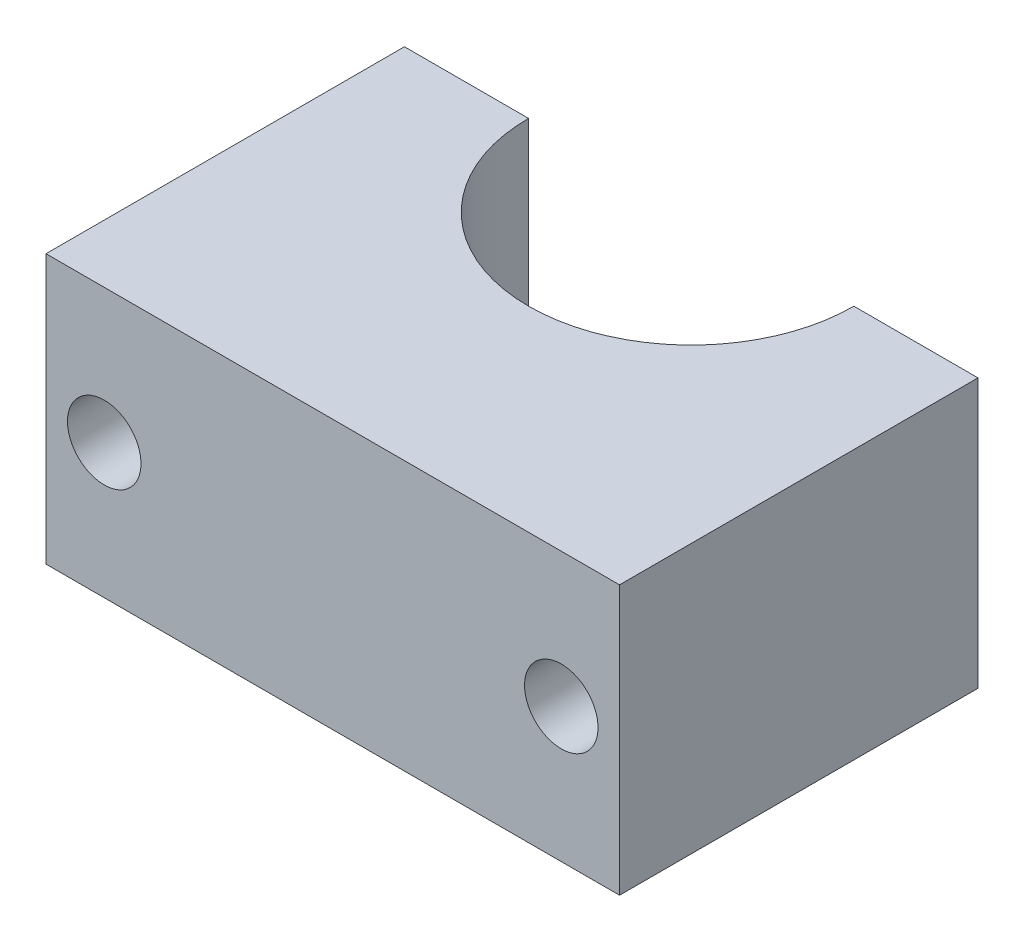
ISO-10303-21;
HEADER;
FILE_DESCRIPTION(('STEP AP214'),'2;1');
FILE_NAME('part.step','',(''),(''),'','','');
FILE_SCHEMA(('AUTOMOTIVE_DESIGN { 1 0 10303 214 1 1 1 1 }'));
ENDSEC;
DATA;
#1=APPLICATION_CONTEXT('core data for automotive mechanical design processes');
#2=APPLICATION_PROTOCOL_DEFINITION('international standard','automotive_design',2000,#1);
#3=PRODUCT_CONTEXT('',#1,'mechanical');
#4=PRODUCT('Part','Part','',(#3));
#5=PRODUCT_RELATED_PRODUCT_CATEGORY('part','',(#4));
#6=PRODUCT_DEFINITION_FORMATION('','',#4);
#7=PRODUCT_DEFINITION_CONTEXT('part definition',#1,'design');
#8=PRODUCT_DEFINITION('design','',#6,#7);
#9=PRODUCT_DEFINITION_SHAPE('','',#8);
#10=(LENGTH_UNIT() NAMED_UNIT(*) SI_UNIT(.MILLI.,.METRE.));
#11=(NAMED_UNIT(*) PLANE_ANGLE_UNIT() SI_UNIT($,.RADIAN.));
#12=(NAMED_UNIT(*) SI_UNIT($,.STERADIAN.) SOLID_ANGLE_UNIT());
#13=UNCERTAINTY_MEASURE_WITH_UNIT(LENGTH_MEASURE(1.E-05),#10,'distance_accuracy_value','');
#14=(GEOMETRIC_REPRESENTATION_CONTEXT(3) GLOBAL_UNCERTAINTY_ASSIGNED_CONTEXT((#13)) GLOBAL_UNIT_ASSIGNED_CONTEXT((#10,
#11,#12)) REPRESENTATION_CONTEXT('',''));
#15=CARTESIAN_POINT('',(0.,0.,0.));
#16=DIRECTION('',(0.,0.,1.));
#17=DIRECTION('',(1.,0.,0.));
#18=AXIS2_PLACEMENT_3D('',#15,#16,#17);
#19=CARTESIAN_POINT('',(-16.,15.,20.));
#20=DIRECTION('',(0.,0.,-1.));
#21=DIRECTION('',(1.,0.,0.));
#22=AXIS2_PLACEMENT_3D('',#19,#20,#21);
#23=PLANE('',#22);
#24=DIRECTION('',(-1.,0.,0.));
#25=VECTOR('',#24,1.);
#26=CARTESIAN_POINT('',(-16.,0.,20.));
#27=LINE('',#26,#25);
#28=CARTESIAN_POINT('',(16.,0.,20.));
#29=VERTEX_POINT('',#28);
#30=CARTESIAN_POINT('',(-16.,0.,20.));
#31=VERTEX_POINT('',#30);
#32=EDGE_CURVE('E162',#29,#31,#27,.T.);
#33=ORIENTED_EDGE('',*,*,#32,.F.);
#34=DIRECTION('',(0.,-1.,0.));
#35=VECTOR('',#34,1.);
#36=CARTESIAN_POINT('',(16.,15.,20.));
#37=LINE('',#36,#35);
#38=CARTESIAN_POINT('',(16.,15.,20.));
#39=VERTEX_POINT('',#38);
#40=EDGE_CURVE('E57',#39,#29,#37,.T.);
#41=ORIENTED_EDGE('',*,*,#40,.F.);
#42=DIRECTION('',(-1.,0.,0.));
#43=VECTOR('',#42,1.);
#44=CARTESIAN_POINT('',(-16.,15.,20.));
#45=LINE('',#44,#43);
#46=CARTESIAN_POINT('',(-16.,15.,20.));
#47=VERTEX_POINT('',#46);
#48=EDGE_CURVE('E147',#39,#47,#45,.T.);
#49=ORIENTED_EDGE('',*,*,#48,.T.);
#50=DIRECTION('',(0.,-1.,0.));
#51=VECTOR('',#50,1.);
#52=CARTESIAN_POINT('',(-16.,15.,20.));
#53=LINE('',#52,#51);
#54=EDGE_CURVE('E137',#47,#31,#53,.T.);
#55=ORIENTED_EDGE('',*,*,#54,.T.);
#56=EDGE_LOOP('',(#33,#41,#49,#55));
#57=FACE_BOUND('',#56,.T.);
#58=CARTESIAN_POINT('',(-14.8,7.5,20.));
#59=CARTESIAN_POINT('',(-14.8000026262811,7.53379238078154,20.));
#60=CARTESIAN_POINT('',(-14.7991942428179,7.56758643234124,20.));
#61=CARTESIAN_POINT('',(-14.795940558804,7.63486152308257,20.));
#62=CARTESIAN_POINT('',(-14.7935065964983,7.66834311264651,20.));
#63=CARTESIAN_POINT('',(-14.7870023729465,7.73499369051859,20.));
#64=CARTESIAN_POINT('',(-14.7829396115088,7.76816340802995,20.));
#65=CARTESIAN_POINT('',(-14.7731825877895,7.83418988229185,20.));
#66=CARTESIAN_POINT('',(-14.7674918203949,7.86704715530245,20.));
#67=CARTESIAN_POINT('',(-14.7544825667202,7.93244907028894,20.));
#68=CARTESIAN_POINT('',(-14.7471635470255,7.96499360615913,20.));
#69=CARTESIAN_POINT('',(-14.7309021282121,8.02977080317995,20.));
#70=CARTESIAN_POINT('',(-14.7219552596725,8.0620023417543,20.));
#71=CARTESIAN_POINT('',(-14.7024411762039,8.12615435267056,20.));
#72=CARTESIAN_POINT('',(-14.6918657567964,8.15807232720354,20.));
#73=CARTESIAN_POINT('',(-14.6691015062152,8.22159971705567,20.));
#74=CARTESIAN_POINT('',(-14.6569010682814,8.25320496793039,20.));
#75=CARTESIAN_POINT('',(-14.6310477444227,8.31569382551715,20.));
#76=CARTESIAN_POINT('',(-14.617399784548,8.34657946951019,20.));
#77=CARTESIAN_POINT('',(-14.5886987439907,8.4074420141325,20.));
#78=CARTESIAN_POINT('',(-14.5736555579828,8.43742357541499,20.));
#79=CARTESIAN_POINT('',(-14.542170984961,8.49648008477325,20.));
#80=CARTESIAN_POINT('',(-14.5257358095649,8.52555834336512,20.));
#81=CARTESIAN_POINT('',(-14.491470140949,8.58280939932996,20.));
#82=CARTESIAN_POINT('',(-14.4736422312409,8.6109837426031,20.));
#83=CARTESIAN_POINT('',(-14.4365949199421,8.66642885055445,20.));
#84=CARTESIAN_POINT('',(-14.4173746140664,8.69369901095303,20.));
#85=CARTESIAN_POINT('',(-14.3775461434011,8.74733815168312,20.));
#86=CARTESIAN_POINT('',(-14.3569338355963,8.77370405487961,20.));
#87=CARTESIAN_POINT('',(-14.3143237381426,8.8255364899181,20.));
#88=CARTESIAN_POINT('',(-14.2923188999089,8.85099722422196,20.));
#89=CARTESIAN_POINT('',(-14.246929665306,8.90102480318845,20.));
#90=CARTESIAN_POINT('',(-14.2235357481671,8.92558300266639,20.));
#91=CARTESIAN_POINT('',(-14.175708557466,8.97344821276768,20.));
#92=CARTESIAN_POINT('',(-14.1512803645065,8.99676029841686,20.));
#93=CARTESIAN_POINT('',(-14.101473180927,9.04200678177793,20.));
#94=CARTESIAN_POINT('',(-14.0761015509679,9.06394927464655,20.));
#95=CARTESIAN_POINT('',(-14.0244135766632,9.10646169520254,20.));
#96=CARTESIAN_POINT('',(-13.9981017038783,9.12703705816632,20.));
#97=CARTESIAN_POINT('',(-13.9445353328715,9.1668172522896,20.));
#98=CARTESIAN_POINT('',(-13.9172826300658,9.18602450053009,20.));
#99=CARTESIAN_POINT('',(-13.8618374488892,9.22307170433965,20.));
#100=CARTESIAN_POINT('',(-13.8336443664193,9.24091075572492,20.));
#101=CARTESIAN_POINT('',(-13.7763208549572,9.27522516249977,20.));
#102=CARTESIAN_POINT('',(-13.7471877759729,9.29169608967256,20.));
#103=CARTESIAN_POINT('',(-13.6879857780212,9.32327683132318,20.));
#104=CARTESIAN_POINT('',(-13.6579125657195,9.3383785923591,20.));
#105=CARTESIAN_POINT('',(-13.5968336753988,9.36722833218206,20.));
#106=CARTESIAN_POINT('',(-13.5658225097764,9.38096468057389,20.));
#107=CARTESIAN_POINT('',(-13.503318736159,9.40688369048613,20.));
#108=CARTESIAN_POINT('',(-13.4718288796688,9.41907298442377,20.));
#109=CARTESIAN_POINT('',(-13.4084979625986,9.44181490025927,20.));
#110=CARTESIAN_POINT('',(-13.3766606044999,9.45237781790876,20.));
#111=CARTESIAN_POINT('',(-13.3126383439554,9.47187404174329,20.));
#112=CARTESIAN_POINT('',(-13.280455492703,9.48081408066136,20.));
#113=CARTESIAN_POINT('',(-13.2157433976693,9.49706722508851,20.));
#114=CARTESIAN_POINT('',(-13.1832148876594,9.50438325076522,20.));
#115=CARTESIAN_POINT('',(-13.1178128684812,9.5173924518626,20.));
#116=CARTESIAN_POINT('',(-13.0849391472144,9.52308456074769,20.));
#117=CARTESIAN_POINT('',(-13.0188475732785,9.53285018071523,20.));
#118=CARTESIAN_POINT('',(-12.9856289669411,9.53691858655075,20.));
#119=CARTESIAN_POINT('',(-12.9188480261383,9.54343976360439,20.));
#120=CARTESIAN_POINT('',(-12.8852848070679,9.54588345142446,20.));
#121=CARTESIAN_POINT('',(-12.8178149529736,9.54916325617212,20.));
#122=CARTESIAN_POINT('',(-12.783907698825,9.5499865280008,20.));
#123=CARTESIAN_POINT('',(-12.7162429659983,9.55001341213798,20.));
#124=CARTESIAN_POINT('',(-12.6824854912632,9.54922420495638,20.));
#125=CARTESIAN_POINT('',(-12.6152723987964,9.54599930280762,20.));
#126=CARTESIAN_POINT('',(-12.5818162616979,9.54357453675292,20.));
#127=CARTESIAN_POINT('',(-12.5152065237006,9.53708644050198,20.));
#128=CARTESIAN_POINT('',(-12.482052241352,9.53303011549765,20.));
#129=CARTESIAN_POINT('',(-12.4160462521484,9.52328181632982,20.));
#130=CARTESIAN_POINT('',(-12.3831941057099,9.51759282085156,20.));
#131=CARTESIAN_POINT('',(-12.317792113078,9.50458348629703,20.));
#132=CARTESIAN_POINT('',(-12.2852424790765,9.49726208070377,20.));
#133=CARTESIAN_POINT('',(-12.2204446856773,9.48099218674987,20.));
#134=CARTESIAN_POINT('',(-12.1881977836743,9.47203869333971,20.));
#135=CARTESIAN_POINT('',(-12.1240046928868,9.45250751570445,20.));
#136=CARTESIAN_POINT('',(-12.0920611628998,9.44192110099016,20.));
#137=CARTESIAN_POINT('',(-12.0284720187022,9.4191316501212,20.));
#138=CARTESIAN_POINT('',(-11.9968307481015,9.40691650971376,20.));
#139=CARTESIAN_POINT('',(-11.9343063982561,9.38104717520967,20.));
#140=CARTESIAN_POINT('',(-11.9034205747921,9.36739961654805,20.));
#141=CARTESIAN_POINT('',(-11.8425578909684,9.33869885853335,20.));
#142=CARTESIAN_POINT('',(-11.8125763684626,9.32365555742574,20.));
#143=CARTESIAN_POINT('',(-11.7535198818038,9.29217089492878,20.));
#144=CARTESIAN_POINT('',(-11.7244416073022,9.27573574471328,20.));
#145=CARTESIAN_POINT('',(-11.667190537439,9.24147009213022,20.));
#146=CARTESIAN_POINT('',(-11.6390161960618,9.22364217348767,20.));
#147=CARTESIAN_POINT('',(-11.5835710904838,9.18659485653725,20.));
#148=CARTESIAN_POINT('',(-11.5563009304613,9.16737455409852,20.));
#149=CARTESIAN_POINT('',(-11.5026617942504,9.1275460900907,20.));
#150=CARTESIAN_POINT('',(-11.4762958950928,9.10693378564294,20.));
#151=CARTESIAN_POINT('',(-11.4244634704812,9.0643236980632,20.));
#152=CARTESIAN_POINT('',(-11.3990027424494,9.04231886648872,20.));
#153=CARTESIAN_POINT('',(-11.3489751789157,8.99692964731105,20.));
#154=CARTESIAN_POINT('',(-11.3244169884831,8.973535739064,20.));
#155=CARTESIAN_POINT('',(-11.2765517870985,8.92570855759071,20.));
#156=CARTESIAN_POINT('',(-11.2532397015473,8.90128036453979,20.));
#157=CARTESIAN_POINT('',(-11.2079932182574,8.85147318089373,20.));
#158=CARTESIAN_POINT('',(-11.1860507253628,8.82610155095892,20.));
#159=CARTESIAN_POINT('',(-11.1435383047878,8.77441357667183,20.));
#160=CARTESIAN_POINT('',(-11.1229629418309,8.74810170388043,20.));
#161=CARTESIAN_POINT('',(-11.0831827477127,8.69453533286895,20.));
#162=CARTESIAN_POINT('',(-11.0639754994704,8.66728263006495,20.));
#163=CARTESIAN_POINT('',(-11.0269282956594,8.61183744888957,20.));
#164=CARTESIAN_POINT('',(-11.0090892442747,8.58364436641919,20.));
#165=CARTESIAN_POINT('',(-10.9747748375002,8.52632085495677,20.));
#166=CARTESIAN_POINT('',(-10.9583039103273,8.49718777597262,20.));
#167=CARTESIAN_POINT('',(-10.9267231686766,8.43798577802109,20.));
#168=CARTESIAN_POINT('',(-10.9116214076408,8.4079125657194,20.));
#169=CARTESIAN_POINT('',(-10.8827716678179,8.34683367539867,20.));
#170=CARTESIAN_POINT('',(-10.8690353194261,8.31582250977641,20.));
#171=CARTESIAN_POINT('',(-10.8431163095138,8.25331873615883,20.));
#172=CARTESIAN_POINT('',(-10.8309270155761,8.2218288796685,20.));
#173=CARTESIAN_POINT('',(-10.8081850997405,8.15849796259797,20.));
#174=CARTESIAN_POINT('',(-10.797622182091,8.12666060449913,20.));
#175=CARTESIAN_POINT('',(-10.7781259582564,8.06263834395449,20.));
#176=CARTESIAN_POINT('',(-10.7691859193383,8.03045549270196,20.));
#177=CARTESIAN_POINT('',(-10.7529327749112,7.9657433976682,20.));
#178=CARTESIAN_POINT('',(-10.7456167492345,7.9332148876583,20.));
#179=CARTESIAN_POINT('',(-10.7326075481371,7.86781286848009,20.));
#180=CARTESIAN_POINT('',(-10.726915439252,7.83493914721325,20.));
#181=CARTESIAN_POINT('',(-10.7171498192845,7.76884757327745,20.));
#182=CARTESIAN_POINT('',(-10.713081413449,7.73562896694021,20.));
#183=CARTESIAN_POINT('',(-10.7065602363954,7.66884802613756,20.));
#184=CARTESIAN_POINT('',(-10.7041165485754,7.63528480706724,20.));
#185=CARTESIAN_POINT('',(-10.7008367438278,7.56781495297324,20.));
#186=CARTESIAN_POINT('',(-10.7000134719992,7.53390769882483,20.));
#187=CARTESIAN_POINT('',(-10.6999865878621,7.46624296599818,20.));
#188=CARTESIAN_POINT('',(-10.7007757950437,7.43248549126289,20.));
#189=CARTESIAN_POINT('',(-10.7040006971926,7.36527239879578,20.));
#190=CARTESIAN_POINT('',(-10.7064254632473,7.33181626169714,20.));
#191=CARTESIAN_POINT('',(-10.7129135594983,7.2652065236997,20.));
#192=CARTESIAN_POINT('',(-10.7169698845026,7.23205224135098,20.));
#193=CARTESIAN_POINT('',(-10.7267181836705,7.16604625214726,20.));
#194=CARTESIAN_POINT('',(-10.7324071791488,7.13319410570879,20.));
#195=CARTESIAN_POINT('',(-10.7454165137033,7.06779211307687,20.));
#196=CARTESIAN_POINT('',(-10.7527379192966,7.03524247907541,20.));
#197=CARTESIAN_POINT('',(-10.7690078132504,6.97044468567631,20.));
#198=CARTESIAN_POINT('',(-10.7779613066606,6.93819778367339,20.));
#199=CARTESIAN_POINT('',(-10.7974924842958,6.87400469288602,20.));
#200=CARTESIAN_POINT('',(-10.80807889901,6.84206116289914,20.));
#201=CARTESIAN_POINT('',(-10.8308683498789,6.77847201870184,20.));
#202=CARTESIAN_POINT('',(-10.8430834902863,6.74683074810129,20.));
#203=CARTESIAN_POINT('',(-10.8689528247903,6.68430639825613,20.));
#204=CARTESIAN_POINT('',(-10.882600383452,6.65342057479216,20.));
#205=CARTESIAN_POINT('',(-10.9113011414667,6.59255789096857,20.));
#206=CARTESIAN_POINT('',(-10.9263444425743,6.56257636846283,20.));
#207=CARTESIAN_POINT('',(-10.9578291050712,6.50351988180403,20.));
#208=CARTESIAN_POINT('',(-10.9742642552867,6.47444160730245,20.));
#209=CARTESIAN_POINT('',(-11.0085299078698,6.41719053743931,20.));
#210=CARTESIAN_POINT('',(-11.0263578265123,6.3890161960621,20.));
#211=CARTESIAN_POINT('',(-11.0634051434628,6.33357109048412,20.));
#212=CARTESIAN_POINT('',(-11.0826254459015,6.30630093046159,20.));
#213=CARTESIAN_POINT('',(-11.1224539099093,6.25266179425068,20.));
#214=CARTESIAN_POINT('',(-11.1430662143571,6.22629589509309,20.));
#215=CARTESIAN_POINT('',(-11.1856763019368,6.17446347048144,20.));
#216=CARTESIAN_POINT('',(-11.2076811335113,6.14900274244961,20.));
#217=CARTESIAN_POINT('',(-11.253070352689,6.09897517891584,20.));
#218=CARTESIAN_POINT('',(-11.276464260936,6.07441698848316,20.));
#219=CARTESIAN_POINT('',(-11.3242914424093,6.02655178709845,20.));
#220=CARTESIAN_POINT('',(-11.3487196354601,6.0032397015473,20.));
#221=CARTESIAN_POINT('',(-11.3985268191061,5.95799321825739,20.));
#222=CARTESIAN_POINT('',(-11.4238984490409,5.93605072536272,20.));
#223=CARTESIAN_POINT('',(-11.475586423328,5.89353830478773,20.));
#224=CARTESIAN_POINT('',(-11.5018982961194,5.87296294183085,20.));
#225=CARTESIAN_POINT('',(-11.5554646671308,5.8331827477126,20.));
#226=CARTESIAN_POINT('',(-11.5827173699348,5.81397549947025,20.));
#227=CARTESIAN_POINT('',(-11.6381625511102,5.77692829565933,20.));
#228=CARTESIAN_POINT('',(-11.6663556335806,5.75908924427457,20.));
#229=CARTESIAN_POINT('',(-11.723679145043,5.72477483750011,20.));
#230=CARTESIAN_POINT('',(-11.7528122240272,5.70830391032721,20.));
#231=CARTESIAN_POINT('',(-11.8120142219788,5.67672316867655,20.));
#232=CARTESIAN_POINT('',(-11.8420874342805,5.6616214076407,20.));
#233=CARTESIAN_POINT('',(-11.9031663246013,5.63277166781786,20.));
#234=CARTESIAN_POINT('',(-11.9341774902236,5.61903531942607,20.));
#235=CARTESIAN_POINT('',(-11.9966812638411,5.59311630951387,20.));
#236=CARTESIAN_POINT('',(-12.0281711203314,5.58092701557624,20.));
#237=CARTESIAN_POINT('',(-12.0915020374019,5.55818509974074,20.));
#238=CARTESIAN_POINT('',(-12.1233393955007,5.54762218209125,20.));
#239=CARTESIAN_POINT('',(-12.1873616560452,5.52812595825671,20.));
#240=CARTESIAN_POINT('',(-12.2195445072977,5.51918591933864,20.));
#241=CARTESIAN_POINT('',(-12.2842566023315,5.50293277491149,20.));
#242=CARTESIAN_POINT('',(-12.3167851123414,5.49561674923478,20.));
#243=CARTESIAN_POINT('',(-12.3821871315196,5.4826075481374,20.));
#244=CARTESIAN_POINT('',(-12.4150608527864,5.47691543925232,20.));
#245=CARTESIAN_POINT('',(-12.4811524267223,5.46714981928477,20.));
#246=CARTESIAN_POINT('',(-12.5143710330595,5.46308141344925,20.));
#247=CARTESIAN_POINT('',(-12.5811519738622,5.45656023639561,20.));
#248=CARTESIAN_POINT('',(-12.6147151929326,5.45411654857554,20.));
#249=CARTESIAN_POINT('',(-12.6821850470267,5.45083674382788,20.));
#250=CARTESIAN_POINT('',(-12.7160923011751,5.45001347199921,20.));
#251=CARTESIAN_POINT('',(-12.7837570340019,5.44998658786202,20.));
#252=CARTESIAN_POINT('',(-12.8175145087372,5.45077579504362,20.));
#253=CARTESIAN_POINT('',(-12.8847276012044,5.45400069719238,20.));
#254=CARTESIAN_POINT('',(-12.9181837383031,5.45642546324707,20.));
#255=CARTESIAN_POINT('',(-12.9847934763006,5.46291355949801,20.));
#256=CARTESIAN_POINT('',(-13.0179477586493,5.46696988450234,20.));
#257=CARTESIAN_POINT('',(-13.0839537478531,5.47671818367017,20.));
#258=CARTESIAN_POINT('',(-13.1168058942915,5.48240717914844,20.));
#259=CARTESIAN_POINT('',(-13.1822078869235,5.49541651370297,20.));
#260=CARTESIAN_POINT('',(-13.2147575209249,5.50273791929622,20.));
#261=CARTESIAN_POINT('',(-13.279555314324,5.51900781325013,20.));
#262=CARTESIAN_POINT('',(-13.3118022163269,5.52796130666028,20.));
#263=CARTESIAN_POINT('',(-13.3759953071142,5.54749248429554,20.));
#264=CARTESIAN_POINT('',(-13.4079388371011,5.55807889900982,20.));
#265=CARTESIAN_POINT('',(-13.4715279812983,5.5808683498788,20.));
#266=CARTESIAN_POINT('',(-13.5031692518988,5.59308349028624,20.));
#267=CARTESIAN_POINT('',(-13.5656936017441,5.61895282479048,20.));
#268=CARTESIAN_POINT('',(-13.5965794252082,5.63260038345227,20.));
#269=CARTESIAN_POINT('',(-13.6574421090322,5.66130114146723,20.));
#270=CARTESIAN_POINT('',(-13.6874236315381,5.67634444257495,20.));
#271=CARTESIAN_POINT('',(-13.7464801181971,5.70782910507207,20.));
#272=CARTESIAN_POINT('',(-13.7755583926988,5.72426425528763,20.));
#273=CARTESIAN_POINT('',(-13.832809462562,5.7585299078708,20.));
#274=CARTESIAN_POINT('',(-13.8609838039392,5.77635782651339,20.));
#275=CARTESIAN_POINT('',(-13.9164289095173,5.81340514346375,20.));
#276=CARTESIAN_POINT('',(-13.94369906954,5.83262544590237,20.));
#277=CARTESIAN_POINT('',(-13.9973382057502,5.87245390991034,20.));
#278=CARTESIAN_POINT('',(-14.023704104907,5.89306621435835,20.));
#279=CARTESIAN_POINT('',(-14.0755365295205,5.93567630193703,20.));
#280=CARTESIAN_POINT('',(-14.1009972575552,5.95768113351017,20.));
#281=CARTESIAN_POINT('',(-14.1510248210805,6.00307035269094,20.));
#282=CARTESIAN_POINT('',(-14.1755830115019,6.02646426094247,20.));
#283=CARTESIAN_POINT('',(-14.2234482129165,6.07429144240292,20.));
#284=CARTESIAN_POINT('',(-14.2467602985087,6.09871963543662,20.));
#285=CARTESIAN_POINT('',(-14.2920067816865,6.14852681912923,20.));
#286=CARTESIAN_POINT('',(-14.3139492744293,6.17389844912728,20.));
#287=CARTESIAN_POINT('',(-14.3564616954184,6.2255864232415,20.));
#288=CARTESIAN_POINT('',(-14.3770370589382,6.25189829579808,20.));
#289=CARTESIAN_POINT('',(-14.4168172515185,6.3054646674509,20.));
#290=CARTESIAN_POINT('',(-14.436024497665,6.33271737112906,20.));
#291=CARTESIAN_POINT('',(-14.473071707206,6.38816254991451,20.));
#292=CARTESIAN_POINT('',(-14.4909107664233,6.41635562911809,20.));
#293=CARTESIAN_POINT('',(-14.5252251517674,6.47367914951882,20.));
#294=CARTESIAN_POINT('',(-14.5416960495617,6.50281224075638,20.));
#295=CARTESIAN_POINT('',(-14.5732768716559,6.56201420515632,20.));
#296=CARTESIAN_POINT('',(-14.5883787432867,6.59208737133072,20.));
#297=CARTESIAN_POINT('',(-14.6172281800625,6.65316638804775,20.));
#298=CARTESIAN_POINT('',(-14.6309641106664,6.68417772792286,20.));
#299=CARTESIAN_POINT('',(-14.6568992055898,6.74671707183676,20.));
#300=CARTESIAN_POINT('',(-14.6691032809169,6.77824303852396,20.));
#301=CARTESIAN_POINT('',(-14.6918705260358,6.8416358689415,20.));
#302=CARTESIAN_POINT('',(-14.7024444972854,6.87349884771985,20.));
#303=CARTESIAN_POINT('',(-14.7219578983163,6.93756229191174,20.));
#304=CARTESIAN_POINT('',(-14.7309045906109,6.96976054403643,20.));
#305=CARTESIAN_POINT('',(-14.7471662671319,7.03449329432325,20.));
#306=CARTESIAN_POINT('',(-14.7544847095573,7.06702692328642,20.));
#307=CARTESIAN_POINT('',(-14.7674939391066,7.13242900013863,20.));
#308=CARTESIAN_POINT('',(-14.7731841929088,7.16529755409148,20.));
#309=CARTESIAN_POINT('',(-14.7829412419155,7.23136866722272,20.));
#310=CARTESIAN_POINT('',(-14.7870034464539,7.26457190395985,20.));
#311=CARTESIAN_POINT('',(-14.7935076741373,7.33131161252729,20.));
#312=CARTESIAN_POINT('',(-14.7959410991598,7.36484891885623,20.));
#313=CARTESIAN_POINT('',(-14.7991947601912,7.43225769630303,20.));
#314=CARTESIAN_POINT('',(-14.8000025855025,7.46612976890305,20.));
#315=CARTESIAN_POINT('',(-14.8,7.5,20.));
#316=B_SPLINE_CURVE_WITH_KNOTS('',3,(#58,#59,#60,#61,#62,#63,#64,#65,#66,#67,#68,#69,#70,#71,
#72,#73,#74,#75,#76,#77,#78,#79,#80,#81,#82,#83,#84,#85,#86,#87,#88,#89,#90,#91,#92,#93,#94,#95,
#96,#97,#98,#99,#100,#101,#102,#103,#104,#105,#106,#107,#108,#109,#110,#111,#112,#113,#114,#115,
#116,#117,#118,#119,#120,#121,#122,#123,#124,#125,#126,#127,#128,#129,#130,#131,#132,#133,#134,
#135,#136,#137,#138,#139,#140,#141,#142,#143,#144,#145,#146,#147,#148,#149,#150,#151,#152,#153,
#154,#155,#156,#157,#158,#159,#160,#161,#162,#163,#164,#165,#166,#167,#168,#169,#170,#171,#172,
#173,#174,#175,#176,#177,#178,#179,#180,#181,#182,#183,#184,#185,#186,#187,#188,#189,#190,#191,
#192,#193,#194,#195,#196,#197,#198,#199,#200,#201,#202,#203,#204,#205,#206,#207,#208,#209,#210,
#211,#212,#213,#214,#215,#216,#217,#218,#219,#220,#221,#222,#223,#224,#225,#226,#227,#228,#229,
#230,#231,#232,#233,#234,#235,#236,#237,#238,#239,#240,#241,#242,#243,#244,#245,#246,#247,#248,
#249,#250,#251,#252,#253,#254,#255,#256,#257,#258,#259,#260,#261,#262,#263,#264,#265,#266,#267,
#268,#269,#270,#271,#272,#273,#274,#275,#276,#277,#278,#279,#280,#281,#282,#283,#284,#285,#286,
#287,#288,#289,#290,#291,#292,#293,#294,#295,#296,#297,#298,#299,#300,#301,#302,#303,#304,#305,
#306,#307,#308,#309,#310,#311,#312,#313,#314,#315),.UNSPECIFIED.,.F.,.F.,(4,2,2,2,2,2,2,2,2,2,2,
2,2,2,2,2,2,2,2,2,2,2,2,2,2,2,2,2,2,2,2,2,2,2,2,2,2,2,2,2,2,2,2,2,2,2,2,2,2,2,2,2,2,2,2,2,2,2,2,
2,2,2,2,2,2,2,2,2,2,2,2,2,2,2,2,2,2,2,2,2,2,2,2,2,2,2,2,2,2,2,2,2,2,2,2,2,2,2,2,2,2,2,2,2,2,2,2,
2,2,2,2,2,2,2,2,2,2,2,2,2,2,2,2,2,2,2,2,2,4),(0.,0.10136980817498,0.202039855299107,
0.302251595174341,0.402249801518129,0.502280815595935,0.602590736965651,0.703423623045886,
0.805019762478675,0.906280627433045,1.00687148636581,1.10703499589193,1.20701692421191,
1.30706437770678,1.40742397874859,1.50834006122293,1.6100529487687,1.71131384927551,
1.81190473405127,1.9120682593176,2.01205019295003,2.11209764107978,2.21245722590833,
2.31337328123124,2.41508613067616,2.51634703118277,2.61693791595838,2.71710144122462,
2.81708337485703,2.9171308229868,3.01749040781545,3.11840646313851,3.22011931258365,
3.3213802130902,3.42197109786577,3.52213462313199,3.62211655676439,3.72216400489417,
3.82252358972284,3.92343964504594,4.02515249449112,4.1264133949979,4.22700427977362,
4.32716780503993,4.42714973867236,4.52719718680211,4.62755677163069,4.72847282695365,
4.83018567639864,4.93144657690559,5.03203746168145,5.13220098694785,5.23218292058031,
5.33223036871003,5.43258995353852,5.53350600886133,5.63521885830611,5.73647975881325,
5.83707064358923,5.9372341688557,6.03721610248818,6.13726355061788,6.2376231354463,
6.338539190769,6.44025204021363,6.54151294072069,6.64210382549662,6.74226735076306,
6.84224928439553,6.94229673252524,7.04265631735369,7.14357237267641,7.24528522212107,
7.34654612262771,7.44713700740334,7.5473005326696,7.64728246630201,7.74732991443178,
7.84768949926041,7.94860555458345,8.05031840402855,8.15157930453546,8.25217018931128,
8.35233371457765,8.4523156482101,8.55236309633984,8.65272268116835,8.75363873649122,
8.85535158593607,8.95661248644302,9.05720337121887,9.15736689648526,9.25734883011771,
9.35739627824744,9.45775586307593,9.55867191839874,9.66038476784352,9.76164566835073,
9.86223655312676,9.96240007839325,10.0623820120257,10.1624294601554,10.2627890449838,
10.3637051003065,10.4654179497511,10.5666788502585,10.6672697350346,10.7674332603012,
10.8674151939337,10.9674626420634,11.0678222268917,11.1687382822142,11.2704511316585,
11.3717120321651,11.4723029169407,11.572466442207,11.6724483758394,11.7724958239691,
11.8728554087978,11.9737714641208,12.0754843135659,12.1768622657421,12.2775365608504,
12.3777498909528,12.4777483043971,12.5777794354468,12.6780906760597,12.7789273565587,
12.8805310011848),.UNSPECIFIED.);
#317=CARTESIAN_POINT('',(-14.8,7.5,20.));
#318=VERTEX_POINT('',#317);
#319=EDGE_CURVE('E187',#318,#318,#316,.T.);
#320=ORIENTED_EDGE('',*,*,#319,.T.);
#321=EDGE_LOOP('',(#320));
#322=FACE_BOUND('',#321,.T.);
#323=CARTESIAN_POINT('',(10.7,7.5,20.));
#324=CARTESIAN_POINT('',(10.6999973737189,7.53379238078154,20.));
#325=CARTESIAN_POINT('',(10.7008057571821,7.56758643234124,20.));
#326=CARTESIAN_POINT('',(10.704059441196,7.63486152308257,20.));
#327=CARTESIAN_POINT('',(10.7064934035017,7.66834311264651,20.));
#328=CARTESIAN_POINT('',(10.7129976270535,7.73499369051859,20.));
#329=CARTESIAN_POINT('',(10.7170603884912,7.76816340802996,20.));
#330=CARTESIAN_POINT('',(10.7268174122105,7.83418988229185,20.));
#331=CARTESIAN_POINT('',(10.7325081796051,7.86704715530245,20.));
#332=CARTESIAN_POINT('',(10.7455174332798,7.93244907028894,20.));
#333=CARTESIAN_POINT('',(10.7528364529745,7.96499360615913,20.));
#334=CARTESIAN_POINT('',(10.7690978717879,8.02977080317995,20.));
#335=CARTESIAN_POINT('',(10.7780447403275,8.06200234175431,20.));
#336=CARTESIAN_POINT('',(10.7975588237961,8.12615435267056,20.));
#337=CARTESIAN_POINT('',(10.8081342432036,8.15807232720354,20.));
#338=CARTESIAN_POINT('',(10.8308984937848,8.22159971705568,20.));
#339=CARTESIAN_POINT('',(10.8430989317186,8.25320496793039,20.));
#340=CARTESIAN_POINT('',(10.8689522555772,8.31569382551706,20.));
#341=CARTESIAN_POINT('',(10.8826002154519,8.34657946951002,20.));
#342=CARTESIAN_POINT('',(10.9113012560092,8.40744201413218,20.));
#343=CARTESIAN_POINT('',(10.926344442017,8.43742357541461,20.));
#344=CARTESIAN_POINT('',(10.9578290150388,8.49648008477278,20.));
#345=CARTESIAN_POINT('',(10.9742641904348,8.52555834336461,20.));
#346=CARTESIAN_POINT('',(11.0085298590508,8.58280939932941,20.));
#347=CARTESIAN_POINT('',(11.0263577687589,8.61098374260253,20.));
#348=CARTESIAN_POINT('',(11.0634050800577,8.66642885055388,20.));
#349=CARTESIAN_POINT('',(11.0826253859334,8.69369901095248,20.));
#350=CARTESIAN_POINT('',(11.1224538565987,8.74733815168261,20.));
#351=CARTESIAN_POINT('',(11.1430661644035,8.77370405487914,20.));
#352=CARTESIAN_POINT('',(11.1856762618572,8.82553648991773,20.));
#353=CARTESIAN_POINT('',(11.207681100091,8.85099722422164,20.));
#354=CARTESIAN_POINT('',(11.2530703346939,8.90102480318828,20.));
#355=CARTESIAN_POINT('',(11.2764642518329,8.9255830026663,20.));
#356=CARTESIAN_POINT('',(11.324291442534,8.97344821276772,20.));
#357=CARTESIAN_POINT('',(11.3487196354934,8.99676029841694,20.));
#358=CARTESIAN_POINT('',(11.398526819073,9.04200678177806,20.));
#359=CARTESIAN_POINT('',(11.423898449032,9.06394927464671,20.));
#360=CARTESIAN_POINT('',(11.4755864233367,9.10646169520273,20.));
#361=CARTESIAN_POINT('',(11.5018982961216,9.12703705816653,20.));
#362=CARTESIAN_POINT('',(11.5554646671284,9.16681725228983,20.));
#363=CARTESIAN_POINT('',(11.5827173699341,9.18602450053033,20.));
#364=CARTESIAN_POINT('',(11.6381625511107,9.22307170433989,20.));
#365=CARTESIAN_POINT('',(11.6663556335806,9.24091075572515,20.));
#366=CARTESIAN_POINT('',(11.7236791450428,9.27522516249998,20.));
#367=CARTESIAN_POINT('',(11.7528122240271,9.29169608967276,20.));
#368=CARTESIAN_POINT('',(11.8120142219787,9.32327683132334,20.));
#369=CARTESIAN_POINT('',(11.8420874342804,9.33837859235924,20.));
#370=CARTESIAN_POINT('',(11.9031663246012,9.36722833218213,20.));
#371=CARTESIAN_POINT('',(11.9341774902235,9.38096468057392,20.));
#372=CARTESIAN_POINT('',(11.9966812638411,9.40688369048613,20.));
#373=CARTESIAN_POINT('',(12.0281711203314,9.41907298442376,20.));
#374=CARTESIAN_POINT('',(12.0915020374018,9.44181490025927,20.));
#375=CARTESIAN_POINT('',(12.1233393955006,9.45237781790875,20.));
#376=CARTESIAN_POINT('',(12.1873616560451,9.47187404174329,20.));
#377=CARTESIAN_POINT('',(12.2195445072976,9.48081408066136,20.));
#378=CARTESIAN_POINT('',(12.2842566023313,9.49706722508851,20.));
#379=CARTESIAN_POINT('',(12.3167851123412,9.50438325076522,20.));
#380=CARTESIAN_POINT('',(12.3821871315194,9.5173924518626,20.));
#381=CARTESIAN_POINT('',(12.4150608527863,9.52308456074768,20.));
#382=CARTESIAN_POINT('',(12.4811524267221,9.53285018071523,20.));
#383=CARTESIAN_POINT('',(12.5143710330594,9.53691858655075,20.));
#384=CARTESIAN_POINT('',(12.5811519738621,9.54343976360439,20.));
#385=CARTESIAN_POINT('',(12.6147151929325,9.54588345142446,20.));
#386=CARTESIAN_POINT('',(12.6821850470266,9.54916325617212,20.));
#387=CARTESIAN_POINT('',(12.7160923011751,9.54998652800079,20.));
#388=CARTESIAN_POINT('',(12.7837570340016,9.55001341213798,20.));
#389=CARTESIAN_POINT('',(12.8175145087368,9.54922420495638,20.));
#390=CARTESIAN_POINT('',(12.8847276012036,9.54599930280762,20.));
#391=CARTESIAN_POINT('',(12.9181837383021,9.54357453675292,20.));
#392=CARTESIAN_POINT('',(12.9847934762994,9.53708644050198,20.));
#393=CARTESIAN_POINT('',(13.017947758648,9.53303011549765,20.));
#394=CARTESIAN_POINT('',(13.0839537478516,9.52328181632982,20.));
#395=CARTESIAN_POINT('',(13.1168058942901,9.51759282085156,20.));
#396=CARTESIAN_POINT('',(13.182207886922,9.50458348629703,20.));
#397=CARTESIAN_POINT('',(13.2147575209235,9.49726208070377,20.));
#398=CARTESIAN_POINT('',(13.2795553143227,9.48099218674987,20.));
#399=CARTESIAN_POINT('',(13.3118022163257,9.47203869333971,20.));
#400=CARTESIAN_POINT('',(13.3759953071132,9.45250751570445,20.));
#401=CARTESIAN_POINT('',(13.4079388371002,9.44192110099017,20.));
#402=CARTESIAN_POINT('',(13.4715279812978,9.4191316501212,20.));
#403=CARTESIAN_POINT('',(13.5031692518985,9.40691650971376,20.));
#404=CARTESIAN_POINT('',(13.565693601744,9.38104717520964,20.));
#405=CARTESIAN_POINT('',(13.5965794252081,9.36739961654798,20.));
#406=CARTESIAN_POINT('',(13.6574421090319,9.33869885853322,20.));
#407=CARTESIAN_POINT('',(13.6874236315378,9.32365555742559,20.));
#408=CARTESIAN_POINT('',(13.7464801181967,9.29217089492859,20.));
#409=CARTESIAN_POINT('',(13.7755583926983,9.27573574471308,20.));
#410=CARTESIAN_POINT('',(13.8328094625616,9.24147009213,20.));
#411=CARTESIAN_POINT('',(13.8609838039388,9.22364217348744,20.));
#412=CARTESIAN_POINT('',(13.9164289095168,9.18659485653702,20.));
#413=CARTESIAN_POINT('',(13.9436990695393,9.16737455409829,20.));
#414=CARTESIAN_POINT('',(13.9973382057501,9.12754609009049,20.));
#415=CARTESIAN_POINT('',(14.0237041049077,9.10693378564275,20.));
#416=CARTESIAN_POINT('',(14.0755365295192,9.06432369806305,20.));
#417=CARTESIAN_POINT('',(14.1009972575509,9.0423188664886,20.));
#418=CARTESIAN_POINT('',(14.1510248210844,8.99692964731098,20.));
#419=CARTESIAN_POINT('',(14.175583011517,8.97353573906397,20.));
#420=CARTESIAN_POINT('',(14.2234482129016,8.92570855759054,20.));
#421=CARTESIAN_POINT('',(14.2467602984529,8.90128036453945,20.));
#422=CARTESIAN_POINT('',(14.292006781743,8.8514731808931,20.));
#423=CARTESIAN_POINT('',(14.3139492746377,8.82610155095817,20.));
#424=CARTESIAN_POINT('',(14.3564616952128,8.7744135766709,20.));
#425=CARTESIAN_POINT('',(14.3770370581698,8.74810170387943,20.));
#426=CARTESIAN_POINT('',(14.4168172522881,8.69453533286785,20.));
#427=CARTESIAN_POINT('',(14.4360245005304,8.66728263006383,20.));
#428=CARTESIAN_POINT('',(14.4730717043414,8.61183744888845,20.));
#429=CARTESIAN_POINT('',(14.4909107557261,8.58364436641809,20.));
#430=CARTESIAN_POINT('',(14.5252251625005,8.52632085495576,20.));
#431=CARTESIAN_POINT('',(14.5416960896734,8.49718777597168,20.));
#432=CARTESIAN_POINT('',(14.5732768313239,8.43798577802035,20.));
#433=CARTESIAN_POINT('',(14.5883785923597,8.40791256571878,20.));
#434=CARTESIAN_POINT('',(14.6172283321823,8.34683367539833,20.));
#435=CARTESIAN_POINT('',(14.630964680574,8.31582250977624,20.));
#436=CARTESIAN_POINT('',(14.6568836904861,8.25331873615883,20.));
#437=CARTESIAN_POINT('',(14.6690729844238,8.2218288796685,20.));
#438=CARTESIAN_POINT('',(14.6918149002593,8.15849796259796,20.));
#439=CARTESIAN_POINT('',(14.7023778179087,8.12666060449913,20.));
#440=CARTESIAN_POINT('',(14.7218740417433,8.06263834395449,20.));
#441=CARTESIAN_POINT('',(14.7308140806614,8.03045549270196,20.));
#442=CARTESIAN_POINT('',(14.7470672250885,7.9657433976682,20.));
#443=CARTESIAN_POINT('',(14.7543832507652,7.9332148876583,20.));
#444=CARTESIAN_POINT('',(14.7673924518626,7.86781286848009,20.));
#445=CARTESIAN_POINT('',(14.7730845607477,7.83493914721325,20.));
#446=CARTESIAN_POINT('',(14.7828501807152,7.76884757327745,20.));
#447=CARTESIAN_POINT('',(14.7869185865508,7.73562896694021,20.));
#448=CARTESIAN_POINT('',(14.7934397636044,7.66884802613756,20.));
#449=CARTESIAN_POINT('',(14.7958834514245,7.63528480706724,20.));
#450=CARTESIAN_POINT('',(14.7991632561721,7.56781495297324,20.));
#451=CARTESIAN_POINT('',(14.7999865280008,7.53390769882483,20.));
#452=CARTESIAN_POINT('',(14.800013412138,7.46624296599818,20.));
#453=CARTESIAN_POINT('',(14.7992242049564,7.43248549126289,20.));
#454=CARTESIAN_POINT('',(14.7959993028076,7.36527239879578,20.));
#455=CARTESIAN_POINT('',(14.7935745367529,7.33181626169714,20.));
#456=CARTESIAN_POINT('',(14.787086440502,7.2652065236997,20.));
#457=CARTESIAN_POINT('',(14.7830301154977,7.23205224135098,20.));
#458=CARTESIAN_POINT('',(14.7732818163298,7.16604625214726,20.));
#459=CARTESIAN_POINT('',(14.7675928208516,7.13319410570879,20.));
#460=CARTESIAN_POINT('',(14.754583486297,7.06779211307686,20.));
#461=CARTESIAN_POINT('',(14.7472620807038,7.03524247907541,20.));
#462=CARTESIAN_POINT('',(14.7309921867499,6.9704446856763,20.));
#463=CARTESIAN_POINT('',(14.7220386933397,6.93819778367338,20.));
#464=CARTESIAN_POINT('',(14.7025075157045,6.87400469288601,20.));
#465=CARTESIAN_POINT('',(14.6919211009902,6.84206116289914,20.));
#466=CARTESIAN_POINT('',(14.6691316501212,6.77847201870184,20.));
#467=CARTESIAN_POINT('',(14.6569165097138,6.74683074810129,20.));
#468=CARTESIAN_POINT('',(14.6310471752096,6.68430639825613,20.));
#469=CARTESIAN_POINT('',(14.6173996165479,6.65342057479216,20.));
#470=CARTESIAN_POINT('',(14.5886988585332,6.59255789096857,20.));
#471=CARTESIAN_POINT('',(14.5736555574255,6.56257636846283,20.));
#472=CARTESIAN_POINT('',(14.5421708949285,6.50351988180403,20.));
#473=CARTESIAN_POINT('',(14.525735744713,6.47444160730245,20.));
#474=CARTESIAN_POINT('',(14.4914700921299,6.41719053743932,20.));
#475=CARTESIAN_POINT('',(14.4736421734873,6.3890161960621,20.));
#476=CARTESIAN_POINT('',(14.4365948565369,6.33357109048412,20.));
#477=CARTESIAN_POINT('',(14.4173745540982,6.3063009304616,20.));
#478=CARTESIAN_POINT('',(14.3775460900904,6.25266179425069,20.));
#479=CARTESIAN_POINT('',(14.3569337856427,6.22629589509309,20.));
#480=CARTESIAN_POINT('',(14.314323698063,6.17446347048144,20.));
#481=CARTESIAN_POINT('',(14.2923188664885,6.14900274244962,20.));
#482=CARTESIAN_POINT('',(14.2469296473109,6.09897517891585,20.));
#483=CARTESIAN_POINT('',(14.223535739064,6.07441698848316,20.));
#484=CARTESIAN_POINT('',(14.1757085575909,6.02655178709856,20.));
#485=CARTESIAN_POINT('',(14.1512803645402,6.0032397015475,20.));
#486=CARTESIAN_POINT('',(14.1014731808944,5.95799321825777,20.));
#487=CARTESIAN_POINT('',(14.0761015509598,5.93605072536318,20.));
#488=CARTESIAN_POINT('',(14.0244135766729,5.89353830478831,20.));
#489=CARTESIAN_POINT('',(13.9981017038816,5.87296294183148,20.));
#490=CARTESIAN_POINT('',(13.9445353328702,5.83318274771329,20.));
#491=CARTESIAN_POINT('',(13.9172826300662,5.81397549947095,20.));
#492=CARTESIAN_POINT('',(13.8618374488908,5.77692829566003,20.));
#493=CARTESIAN_POINT('',(13.8336443664204,5.75908924427526,20.));
#494=CARTESIAN_POINT('',(13.7763208549579,5.72477483750074,20.));
#495=CARTESIAN_POINT('',(13.7471877759737,5.70830391032779,20.));
#496=CARTESIAN_POINT('',(13.6879857780219,5.67672316867701,20.));
#497=CARTESIAN_POINT('',(13.6579125657201,5.66162140764109,20.));
#498=CARTESIAN_POINT('',(13.596833675399,5.63277166781807,20.));
#499=CARTESIAN_POINT('',(13.5658225097766,5.61903531942617,20.));
#500=CARTESIAN_POINT('',(13.503318736159,5.59311630951387,20.));
#501=CARTESIAN_POINT('',(13.4718288796688,5.58092701557623,20.));
#502=CARTESIAN_POINT('',(13.4084979625985,5.55818509974073,20.));
#503=CARTESIAN_POINT('',(13.3766606044998,5.54762218209124,20.));
#504=CARTESIAN_POINT('',(13.3126383439553,5.52812595825671,20.));
#505=CARTESIAN_POINT('',(13.2804554927028,5.51918591933864,20.));
#506=CARTESIAN_POINT('',(13.2157433976692,5.50293277491149,20.));
#507=CARTESIAN_POINT('',(13.1832148876593,5.49561674923478,20.));
#508=CARTESIAN_POINT('',(13.1178128684811,5.4826075481374,20.));
#509=CARTESIAN_POINT('',(13.0849391472142,5.47691543925231,20.));
#510=CARTESIAN_POINT('',(13.0188475732783,5.46714981928477,20.));
#511=CARTESIAN_POINT('',(12.985628966941,5.46308141344925,20.));
#512=CARTESIAN_POINT('',(12.9188480261382,5.45656023639561,20.));
#513=CARTESIAN_POINT('',(12.8852848070678,5.45411654857554,20.));
#514=CARTESIAN_POINT('',(12.8178149529735,5.45083674382788,20.));
#515=CARTESIAN_POINT('',(12.783907698825,5.45001347199921,20.));
#516=CARTESIAN_POINT('',(12.716242965998,5.44998658786202,20.));
#517=CARTESIAN_POINT('',(12.6824854912626,5.45077579504362,20.));
#518=CARTESIAN_POINT('',(12.6152723987952,5.45400069719238,20.));
#519=CARTESIAN_POINT('',(12.5818162616965,5.45642546324707,20.));
#520=CARTESIAN_POINT('',(12.5152065236989,5.46291355949801,20.));
#521=CARTESIAN_POINT('',(12.4820522413501,5.46696988450234,20.));
#522=CARTESIAN_POINT('',(12.4160462521463,5.47671818367017,20.));
#523=CARTESIAN_POINT('',(12.3831941057078,5.48240717914843,20.));
#524=CARTESIAN_POINT('',(12.3177921130759,5.49541651370296,20.));
#525=CARTESIAN_POINT('',(12.2852424790744,5.50273791929622,20.));
#526=CARTESIAN_POINT('',(12.2204446856754,5.51900781325012,20.));
#527=CARTESIAN_POINT('',(12.1881977836726,5.52796130666028,20.));
#528=CARTESIAN_POINT('',(12.1240046928854,5.54749248429553,20.));
#529=CARTESIAN_POINT('',(12.0920611628986,5.55807889900982,20.));
#530=CARTESIAN_POINT('',(12.0284720187015,5.58086834987879,20.));
#531=CARTESIAN_POINT('',(11.9968307481011,5.59308349028625,20.));
#532=CARTESIAN_POINT('',(11.9343063982558,5.61895282479059,20.));
#533=CARTESIAN_POINT('',(11.9034205747914,5.63260038345248,20.));
#534=CARTESIAN_POINT('',(11.8425578909672,5.66130114146763,20.));
#535=CARTESIAN_POINT('',(11.8125763684613,5.67634444257541,20.));
#536=CARTESIAN_POINT('',(11.753519881802,5.70782910507265,20.));
#537=CARTESIAN_POINT('',(11.7244416073003,5.72426425528826,20.));
#538=CARTESIAN_POINT('',(11.667190537437,5.75852990787148,20.));
#539=CARTESIAN_POINT('',(11.6390161960598,5.77635782651409,20.));
#540=CARTESIAN_POINT('',(11.5835710904817,5.81340514346445,20.));
#541=CARTESIAN_POINT('',(11.556300930459,5.83262544590306,20.));
#542=CARTESIAN_POINT('',(11.5026617942488,5.87245390991097,20.));
#543=CARTESIAN_POINT('',(11.4762958950922,5.89306621435893,20.));
#544=CARTESIAN_POINT('',(11.4244634704788,5.93567630193749,20.));
#545=CARTESIAN_POINT('',(11.3990027424443,5.95768113351055,20.));
#546=CARTESIAN_POINT('',(11.3489751789192,6.00307035269115,20.));
#547=CARTESIAN_POINT('',(11.3244169884979,6.02646426094257,20.));
#548=CARTESIAN_POINT('',(11.2765517870834,6.074291442403,20.));
#549=CARTESIAN_POINT('',(11.2532397014913,6.09871963543679,20.));
#550=CARTESIAN_POINT('',(11.2079932183134,6.14852681912955,20.));
#551=CARTESIAN_POINT('',(11.1860507255706,6.17389844912765,20.));
#552=CARTESIAN_POINT('',(11.1435383045814,6.22558642324196,20.));
#553=CARTESIAN_POINT('',(11.1229629410616,6.25189829579858,20.));
#554=CARTESIAN_POINT('',(11.0831827484812,6.30546466745145,20.));
#555=CARTESIAN_POINT('',(11.0639755023348,6.33271737112962,20.));
#556=CARTESIAN_POINT('',(11.0269282927938,6.38816254991507,20.));
#557=CARTESIAN_POINT('',(11.0090892335765,6.41635562911864,20.));
#558=CARTESIAN_POINT('',(10.9747748482324,6.47367914951932,20.));
#559=CARTESIAN_POINT('',(10.9583039504381,6.50281224075684,20.));
#560=CARTESIAN_POINT('',(10.9267231283439,6.56201420515669,20.));
#561=CARTESIAN_POINT('',(10.9116212567132,6.59208737133103,20.));
#562=CARTESIAN_POINT('',(10.8827718199374,6.65316638804793,20.));
#563=CARTESIAN_POINT('',(10.8690358893336,6.68417772792295,20.));
#564=CARTESIAN_POINT('',(10.8431007944102,6.74671707183676,20.));
#565=CARTESIAN_POINT('',(10.8308967190831,6.77824303852396,20.));
#566=CARTESIAN_POINT('',(10.8081294739642,6.8416358689415,20.));
#567=CARTESIAN_POINT('',(10.7975555027146,6.87349884771985,20.));
#568=CARTESIAN_POINT('',(10.7780421016837,6.93756229191174,20.));
#569=CARTESIAN_POINT('',(10.7690954093891,6.96976054403643,20.));
#570=CARTESIAN_POINT('',(10.7528337328681,7.03449329432324,20.));
#571=CARTESIAN_POINT('',(10.7455152904427,7.06702692328642,20.));
#572=CARTESIAN_POINT('',(10.7325060608934,7.13242900013863,20.));
#573=CARTESIAN_POINT('',(10.7268158070912,7.16529755409148,20.));
#574=CARTESIAN_POINT('',(10.7170587580845,7.23136866722272,20.));
#575=CARTESIAN_POINT('',(10.7129965535461,7.26457190395985,20.));
#576=CARTESIAN_POINT('',(10.7064923258627,7.33131161252728,20.));
#577=CARTESIAN_POINT('',(10.7040589008402,7.36484891885623,20.));
#578=CARTESIAN_POINT('',(10.7008052398088,7.43225769630303,20.));
#579=CARTESIAN_POINT('',(10.6999974144975,7.46612976890305,20.));
#580=CARTESIAN_POINT('',(10.7,7.5,20.));
#581=B_SPLINE_CURVE_WITH_KNOTS('',3,(#323,#324,#325,#326,#327,#328,#329,#330,#331,#332,#333,
#334,#335,#336,#337,#338,#339,#340,#341,#342,#343,#344,#345,#346,#347,#348,#349,#350,#351,#352,
#353,#354,#355,#356,#357,#358,#359,#360,#361,#362,#363,#364,#365,#366,#367,#368,#369,#370,#371,
#372,#373,#374,#375,#376,#377,#378,#379,#380,#381,#382,#383,#384,#385,#386,#387,#388,#389,#390,
#391,#392,#393,#394,#395,#396,#397,#398,#399,#400,#401,#402,#403,#404,#405,#406,#407,#408,#409,
#410,#411,#412,#413,#414,#415,#416,#417,#418,#419,#420,#421,#422,#423,#424,#425,#426,#427,#428,
#429,#430,#431,#432,#433,#434,#435,#436,#437,#438,#439,#440,#441,#442,#443,#444,#445,#446,#447,
#448,#449,#450,#451,#452,#453,#454,#455,#456,#457,#458,#459,#460,#461,#462,#463,#464,#465,#466,
#467,#468,#469,#470,#471,#472,#473,#474,#475,#476,#477,#478,#479,#480,#481,#482,#483,#484,#485,
#486,#487,#488,#489,#490,#491,#492,#493,#494,#495,#496,#497,#498,#499,#500,#501,#502,#503,#504,
#505,#506,#507,#508,#509,#510,#511,#512,#513,#514,#515,#516,#517,#518,#519,#520,#521,#522,#523,
#524,#525,#526,#527,#528,#529,#530,#531,#532,#533,#534,#535,#536,#537,#538,#539,#540,#541,#542,
#543,#544,#545,#546,#547,#548,#549,#550,#551,#552,#553,#554,#555,#556,#557,#558,#559,#560,#561,
#562,#563,#564,#565,#566,#567,#568,#569,#570,#571,#572,#573,#574,#575,#576,#577,#578,#579,#580),
.UNSPECIFIED.,.F.,.F.,(4,2,2,2,2,2,2,2,2,2,2,2,2,2,2,2,2,2,2,2,2,2,2,2,2,2,2,2,2,2,2,2,2,2,2,2,
2,2,2,2,2,2,2,2,2,2,2,2,2,2,2,2,2,2,2,2,2,2,2,2,2,2,2,2,2,2,2,2,2,2,2,2,2,2,2,2,2,2,2,2,2,2,2,2,
2,2,2,2,2,2,2,2,2,2,2,2,2,2,2,2,2,2,2,2,2,2,2,2,2,2,2,2,2,2,2,2,2,2,2,2,2,2,2,2,2,2,2,2,4),(0.,
0.101369808174981,0.202039855299109,0.302251595174343,0.402249801518131,0.502280815595936,
0.602590736965654,0.703423623045889,0.805019762478675,0.90628062743277,1.00687148636534,
1.10703499589134,1.20701692421129,1.3070643777062,1.40742397874812,1.50834006122264,
1.61005294876867,1.71131384927552,1.8119047340513,1.91206825931765,2.01205019295009,
2.11209764107983,2.21245722590837,2.31337328123128,2.41508613067619,2.51634703118308,
2.61693791595889,2.71710144122525,2.8170833748577,2.91713082298743,3.01749040781595,
3.1184064631388,3.22011931258364,3.32138021309019,3.42197109786577,3.52213462313199,
3.62211655676438,3.72216400489417,3.82252358972284,3.92343964504594,4.02515249449112,
4.12641339499817,4.22700427977409,4.32716780504051,4.42714973867298,4.5271971868027,
4.62755677163116,4.72847282695394,4.83018567639867,4.93144657690624,5.03203746168253,
5.13220098694919,5.23218292058174,5.33223036871138,5.4325899535396,5.53350600886198,
5.63521885830615,5.73647975881323,5.83707064358918,5.93723416885563,6.03721610248811,
6.13726355061782,6.23762313544625,6.33853919076895,6.44025204021358,6.54151294072064,
6.64210382549657,6.742267350763,6.84224928439547,6.94229673252518,7.04265631735364,
7.1435723726764,7.24528522212111,7.34654612262781,7.44713700740349,7.54730053266978,
7.6472824663022,7.74732991443196,7.84768949926055,7.94860555458352,8.05031840402851,
8.15157930453488,8.2521701893103,8.35233371457644,8.4523156482088,8.55236309633862,
8.65272268116738,8.75363873649063,8.85535158593604,8.95661248644271,9.05720337121836,
9.15736689648462,9.25734883011704,9.35739627824681,9.45775586307543,9.55867191839845,
9.66038476784352,9.76164566835102,9.86223655312727,9.96240007839388,10.0623820120264,
10.1624294601561,10.2627890449843,10.3637051003068,10.4654179497511,10.566678850259,
10.6672697350356,10.7674332603024,10.867415193935,10.9674626420646,11.0678222268927,
11.1687382822148,11.2704511316586,11.3717120321654,11.4723029169412,11.5724664422075,
11.67244837584,11.7724958239697,11.8728554087983,11.9737714641211,12.075484313566,
12.1768622657421,12.2775365608504,12.3777498909528,12.4777483043971,12.5777794354468,
12.6780906760597,12.7789273565587,12.8805310011848),.UNSPECIFIED.);
#582=CARTESIAN_POINT('',(10.7,7.5,20.));
#583=VERTEX_POINT('',#582);
#584=EDGE_CURVE('E244',#583,#583,#581,.T.);
#585=ORIENTED_EDGE('',*,*,#584,.T.);
#586=EDGE_LOOP('',(#585));
#587=FACE_BOUND('',#586,.T.);
#588=ADVANCED_FACE('F43',(#57,#322,#587),#23,.F.);
#589=CARTESIAN_POINT('',(9.075,15.,0.));
#590=DIRECTION('',(0.,0.,1.));
#591=DIRECTION('',(-1.,0.,0.));
#592=AXIS2_PLACEMENT_3D('',#589,#590,#591);
#593=PLANE('',#592);
#594=CARTESIAN_POINT('',(12.75,7.5,0.));
#595=DIRECTION('',(0.,0.,-1.));
#596=DIRECTION('',(-1.,0.,0.));
#597=AXIS2_PLACEMENT_3D('',#594,#595,#596);
#598=CIRCLE('',#597,2.05);
#599=CARTESIAN_POINT('',(10.7,7.5,0.));
#600=VERTEX_POINT('',#599);
#601=EDGE_CURVE('E158',#600,#600,#598,.T.);
#602=ORIENTED_EDGE('',*,*,#601,.F.);
#603=EDGE_LOOP('',(#602));
#604=FACE_BOUND('',#603,.T.);
#605=DIRECTION('',(1.,0.,0.));
#606=VECTOR('',#605,1.);
#607=CARTESIAN_POINT('',(9.075,0.,0.));
#608=LINE('',#607,#606);
#609=CARTESIAN_POINT('',(9.075,0.,0.));
#610=VERTEX_POINT('',#609);
#611=CARTESIAN_POINT('',(16.,0.,0.));
#612=VERTEX_POINT('',#611);
#613=EDGE_CURVE('E157',#610,#612,#608,.T.);
#614=ORIENTED_EDGE('',*,*,#613,.F.);
#615=DIRECTION('',(0.,-1.,0.));
#616=VECTOR('',#615,1.);
#617=CARTESIAN_POINT('',(9.075,15.,0.));
#618=LINE('',#617,#616);
#619=CARTESIAN_POINT('',(9.075,15.,0.));
#620=VERTEX_POINT('',#619);
#621=EDGE_CURVE('E151',#620,#610,#618,.T.);
#622=ORIENTED_EDGE('',*,*,#621,.F.);
#623=DIRECTION('',(1.,0.,0.));
#624=VECTOR('',#623,1.);
#625=CARTESIAN_POINT('',(9.075,15.,0.));
#626=LINE('',#625,#624);
#627=CARTESIAN_POINT('',(16.,15.,0.));
#628=VERTEX_POINT('',#627);
#629=EDGE_CURVE('E174',#620,#628,#626,.T.);
#630=ORIENTED_EDGE('',*,*,#629,.T.);
#631=DIRECTION('',(0.,-1.,0.));
#632=VECTOR('',#631,1.);
#633=CARTESIAN_POINT('',(16.,15.,0.));
#634=LINE('',#633,#632);
#635=EDGE_CURVE('E11',#628,#612,#634,.T.);
#636=ORIENTED_EDGE('',*,*,#635,.T.);
#637=EDGE_LOOP('',(#614,#622,#630,#636));
#638=FACE_BOUND('',#637,.T.);
#639=ADVANCED_FACE('F44',(#604,#638),#593,.F.);
#640=CARTESIAN_POINT('',(16.,15.,20.));
#641=DIRECTION('',(-1.,0.,0.));
#642=DIRECTION('',(0.,0.,-1.));
#643=AXIS2_PLACEMENT_3D('',#640,#641,#642);
#644=PLANE('',#643);
#645=DIRECTION('',(0.,0.,1.));
#646=VECTOR('',#645,1.);
#647=CARTESIAN_POINT('',(16.,0.,20.));
#648=LINE('',#647,#646);
#649=EDGE_CURVE('E159',#612,#29,#648,.T.);
#650=ORIENTED_EDGE('',*,*,#649,.F.);
#651=ORIENTED_EDGE('',*,*,#635,.F.);
#652=DIRECTION('',(0.,0.,1.));
#653=VECTOR('',#652,1.);
#654=CARTESIAN_POINT('',(16.,15.,20.));
#655=LINE('',#654,#653);
#656=EDGE_CURVE('E115',#628,#39,#655,.T.);
#657=ORIENTED_EDGE('',*,*,#656,.T.);
#658=ORIENTED_EDGE('',*,*,#40,.T.);
#659=EDGE_LOOP('',(#650,#651,#657,#658));
#660=FACE_BOUND('',#659,.T.);
#661=ADVANCED_FACE('F205',(#660),#644,.F.);
#662=CARTESIAN_POINT('',(-16.,15.,20.));
#663=DIRECTION('',(1.,0.,0.));
#664=DIRECTION('',(0.,0.,1.));
#665=AXIS2_PLACEMENT_3D('',#662,#663,#664);
#666=PLANE('',#665);
#667=DIRECTION('',(0.,0.,-1.));
#668=VECTOR('',#667,1.);
#669=CARTESIAN_POINT('',(-16.,0.,20.));
#670=LINE('',#669,#668);
#671=CARTESIAN_POINT('',(-16.,0.,0.));
#672=VERTEX_POINT('',#671);
#673=EDGE_CURVE('E167',#31,#672,#670,.T.);
#674=ORIENTED_EDGE('',*,*,#673,.F.);
#675=ORIENTED_EDGE('',*,*,#54,.F.);
#676=DIRECTION('',(0.,0.,-1.));
#677=VECTOR('',#676,1.);
#678=CARTESIAN_POINT('',(-16.,15.,20.));
#679=LINE('',#678,#677);
#680=CARTESIAN_POINT('',(-16.,15.,0.));
#681=VERTEX_POINT('',#680);
#682=EDGE_CURVE('E130',#47,#681,#679,.T.);
#683=ORIENTED_EDGE('',*,*,#682,.T.);
#684=DIRECTION('',(0.,-1.,0.));
#685=VECTOR('',#684,1.);
#686=CARTESIAN_POINT('',(-16.,15.,0.));
#687=LINE('',#686,#685);
#688=EDGE_CURVE('E133',#681,#672,#687,.T.);
#689=ORIENTED_EDGE('',*,*,#688,.T.);
#690=EDGE_LOOP('',(#674,#675,#683,#689));
#691=FACE_BOUND('',#690,.T.);
#692=ADVANCED_FACE('F145',(#691),#666,.F.);
#693=CARTESIAN_POINT('',(-16.,15.,0.));
#694=DIRECTION('',(0.,0.,1.));
#695=DIRECTION('',(-1.,0.,0.));
#696=AXIS2_PLACEMENT_3D('',#693,#694,#695);
#697=PLANE('',#696);
#698=CARTESIAN_POINT('',(-12.75,7.5,0.));
#699=DIRECTION('',(0.,0.,-1.));
#700=DIRECTION('',(-1.,0.,0.));
#701=AXIS2_PLACEMENT_3D('',#698,#699,#700);
#702=CIRCLE('',#701,2.05);
#703=CARTESIAN_POINT('',(-14.8,7.5,0.));
#704=VERTEX_POINT('',#703);
#705=EDGE_CURVE('E239',#704,#704,#702,.T.);
#706=ORIENTED_EDGE('',*,*,#705,.F.);
#707=EDGE_LOOP('',(#706));
#708=FACE_BOUND('',#707,.T.);
#709=DIRECTION('',(1.,0.,0.));
#710=VECTOR('',#709,1.);
#711=CARTESIAN_POINT('',(-16.,0.,0.));
#712=LINE('',#711,#710);
#713=CARTESIAN_POINT('',(-9.075,0.,0.));
#714=VERTEX_POINT('',#713);
#715=EDGE_CURVE('E134',#672,#714,#712,.T.);
#716=ORIENTED_EDGE('',*,*,#715,.F.);
#717=ORIENTED_EDGE('',*,*,#688,.F.);
#718=DIRECTION('',(1.,0.,0.));
#719=VECTOR('',#718,1.);
#720=CARTESIAN_POINT('',(-16.,15.,0.));
#721=LINE('',#720,#719);
#722=CARTESIAN_POINT('',(-9.075,15.,0.));
#723=VERTEX_POINT('',#722);
#724=EDGE_CURVE('E121',#681,#723,#721,.T.);
#725=ORIENTED_EDGE('',*,*,#724,.T.);
#726=DIRECTION('',(0.,-1.,0.));
#727=VECTOR('',#726,1.);
#728=CARTESIAN_POINT('',(-9.075,15.,0.));
#729=LINE('',#728,#727);
#730=EDGE_CURVE('E139',#723,#714,#729,.T.);
#731=ORIENTED_EDGE('',*,*,#730,.T.);
#732=EDGE_LOOP('',(#716,#717,#725,#731));
#733=FACE_BOUND('',#732,.T.);
#734=ADVANCED_FACE('F132',(#708,#733),#697,.F.);
#735=CARTESIAN_POINT('',(0.,15.,0.));
#736=DIRECTION('',(0.,-1.,0.));
#737=DIRECTION('',(0.,0.,1.));
#738=AXIS2_PLACEMENT_3D('',#735,#736,#737);
#739=CYLINDRICAL_SURFACE('',#738,9.075);
#740=CARTESIAN_POINT('',(0.,0.,0.));
#741=DIRECTION('',(0.,1.,0.));
#742=DIRECTION('',(0.,0.,-1.));
#743=AXIS2_PLACEMENT_3D('',#740,#741,#742);
#744=CIRCLE('',#743,9.075);
#745=EDGE_CURVE('E96',#714,#610,#744,.T.);
#746=ORIENTED_EDGE('',*,*,#745,.F.);
#747=ORIENTED_EDGE('',*,*,#730,.F.);
#748=CARTESIAN_POINT('',(0.,15.,0.));
#749=DIRECTION('',(0.,1.,0.));
#750=DIRECTION('',(0.,0.,-1.));
#751=AXIS2_PLACEMENT_3D('',#748,#749,#750);
#752=CIRCLE('',#751,9.075);
#753=EDGE_CURVE('E69',#723,#620,#752,.T.);
#754=ORIENTED_EDGE('',*,*,#753,.T.);
#755=ORIENTED_EDGE('',*,*,#621,.T.);
#756=EDGE_LOOP('',(#746,#747,#754,#755));
#757=FACE_BOUND('',#756,.T.);
#758=ADVANCED_FACE('F228',(#757),#739,.F.);
#759=CARTESIAN_POINT('',(0.,15.,0.));
#760=DIRECTION('',(0.,1.,0.));
#761=DIRECTION('',(0.,0.,-1.));
#762=AXIS2_PLACEMENT_3D('',#759,#760,#761);
#763=PLANE('',#762);
#764=ORIENTED_EDGE('',*,*,#629,.F.);
#765=ORIENTED_EDGE('',*,*,#753,.F.);
#766=ORIENTED_EDGE('',*,*,#724,.F.);
#767=ORIENTED_EDGE('',*,*,#682,.F.);
#768=ORIENTED_EDGE('',*,*,#48,.F.);
#769=ORIENTED_EDGE('',*,*,#656,.F.);
#770=EDGE_LOOP('',(#764,#765,#766,#767,#768,#769));
#771=FACE_BOUND('',#770,.T.);
#772=ADVANCED_FACE('F124',(#771),#763,.T.);
#773=CARTESIAN_POINT('',(0.,0.,0.));
#774=DIRECTION('',(0.,1.,0.));
#775=DIRECTION('',(0.,0.,-1.));
#776=AXIS2_PLACEMENT_3D('',#773,#774,#775);
#777=PLANE('',#776);
#778=ORIENTED_EDGE('',*,*,#613,.T.);
#779=ORIENTED_EDGE('',*,*,#649,.T.);
#780=ORIENTED_EDGE('',*,*,#32,.T.);
#781=ORIENTED_EDGE('',*,*,#673,.T.);
#782=ORIENTED_EDGE('',*,*,#715,.T.);
#783=ORIENTED_EDGE('',*,*,#745,.T.);
#784=EDGE_LOOP('',(#778,#779,#780,#781,#782,#783));
#785=FACE_BOUND('',#784,.T.);
#786=ADVANCED_FACE('F220',(#785),#777,.F.);
#787=CARTESIAN_POINT('',(-12.75,7.5,0.));
#788=DIRECTION('',(0.,0.,1.));
#789=DIRECTION('',(-1.,0.,0.));
#790=AXIS2_PLACEMENT_3D('',#787,#788,#789);
#791=CYLINDRICAL_SURFACE('',#790,2.05);
#792=ORIENTED_EDGE('',*,*,#705,.T.);
#793=EDGE_LOOP('',(#792));
#794=FACE_BOUND('',#793,.T.);
#795=ORIENTED_EDGE('',*,*,#319,.F.);
#796=EDGE_LOOP('',(#795));
#797=FACE_BOUND('',#796,.T.);
#798=ADVANCED_FACE('F219',(#794,#797),#791,.F.);
#799=CARTESIAN_POINT('',(12.75,7.5,0.));
#800=DIRECTION('',(0.,0.,1.));
#801=DIRECTION('',(-1.,0.,0.));
#802=AXIS2_PLACEMENT_3D('',#799,#800,#801);
#803=CYLINDRICAL_SURFACE('',#802,2.05);
#804=ORIENTED_EDGE('',*,*,#601,.T.);
#805=EDGE_LOOP('',(#804));
#806=FACE_BOUND('',#805,.T.);
#807=ORIENTED_EDGE('',*,*,#584,.F.);
#808=EDGE_LOOP('',(#807));
#809=FACE_BOUND('',#808,.T.);
#810=ADVANCED_FACE('F224',(#806,#809),#803,.F.);
#811=CLOSED_SHELL('',(#588,#639,#661,#692,#734,#758,#772,#786,#798,#810));
#812=MANIFOLD_SOLID_BREP('B2',#811);
#813=ADVANCED_BREP_SHAPE_REPRESENTATION('',(#18,#812),#14);
#814=SHAPE_DEFINITION_REPRESENTATION(#9,#813);
ENDSEC;
END-ISO-10303-21;
